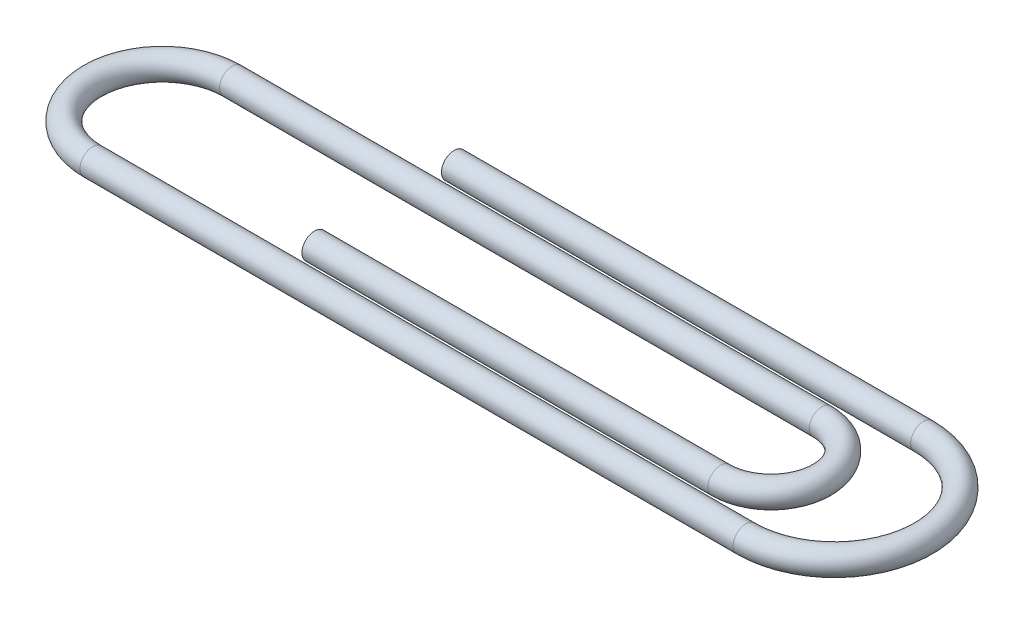
ISO-10303-21;
HEADER;
FILE_DESCRIPTION(('STEP AP214'),'2;1');
FILE_NAME('part.step','',(''),(''),'','','');
FILE_SCHEMA(('AUTOMOTIVE_DESIGN { 1 0 10303 214 1 1 1 1 }'));
ENDSEC;
DATA;
#1=APPLICATION_CONTEXT('core data for automotive mechanical design processes');
#2=APPLICATION_PROTOCOL_DEFINITION('international standard','automotive_design',2000,#1);
#3=PRODUCT_CONTEXT('',#1,'mechanical');
#4=PRODUCT('Part','Part','',(#3));
#5=PRODUCT_RELATED_PRODUCT_CATEGORY('part','',(#4));
#6=PRODUCT_DEFINITION_FORMATION('','',#4);
#7=PRODUCT_DEFINITION_CONTEXT('part definition',#1,'design');
#8=PRODUCT_DEFINITION('design','',#6,#7);
#9=PRODUCT_DEFINITION_SHAPE('','',#8);
#10=(LENGTH_UNIT() NAMED_UNIT(*) SI_UNIT(.MILLI.,.METRE.));
#11=(NAMED_UNIT(*) PLANE_ANGLE_UNIT() SI_UNIT($,.RADIAN.));
#12=(NAMED_UNIT(*) SI_UNIT($,.STERADIAN.) SOLID_ANGLE_UNIT());
#13=UNCERTAINTY_MEASURE_WITH_UNIT(LENGTH_MEASURE(1.E-05),#10,'distance_accuracy_value','');
#14=(GEOMETRIC_REPRESENTATION_CONTEXT(3) GLOBAL_UNCERTAINTY_ASSIGNED_CONTEXT((#13)) GLOBAL_UNIT_ASSIGNED_CONTEXT((#10,
#11,#12)) REPRESENTATION_CONTEXT('',''));
#15=CARTESIAN_POINT('',(0.,0.,0.));
#16=DIRECTION('',(0.,0.,1.));
#17=DIRECTION('',(1.,0.,0.));
#18=AXIS2_PLACEMENT_3D('',#15,#16,#17);
#19=CARTESIAN_POINT('',(0.,0.,0.));
#20=DIRECTION('',(-1.,0.,0.));
#21=DIRECTION('',(0.,0.,1.));
#22=AXIS2_PLACEMENT_3D('',#19,#20,#21);
#23=PLANE('',#22);
#24=CARTESIAN_POINT('',(0.,0.,0.));
#25=DIRECTION('',(-1.,0.,0.));
#26=DIRECTION('',(0.,0.,1.));
#27=AXIS2_PLACEMENT_3D('',#24,#25,#26);
#28=CIRCLE('',#27,0.5);
#29=CARTESIAN_POINT('',(0.,0.,0.5));
#30=VERTEX_POINT('',#29);
#31=EDGE_CURVE('E90',#30,#30,#28,.T.);
#32=ORIENTED_EDGE('',*,*,#31,.T.);
#33=EDGE_LOOP('',(#32));
#34=FACE_BOUND('',#33,.T.);
#35=ADVANCED_FACE('F55',(#34),#23,.T.);
#36=CARTESIAN_POINT('',(0.,0.,5.5));
#37=DIRECTION('',(1.,0.,0.));
#38=DIRECTION('',(0.,0.,-1.));
#39=AXIS2_PLACEMENT_3D('',#36,#37,#38);
#40=PLANE('',#39);
#41=CARTESIAN_POINT('',(0.,0.,5.5));
#42=DIRECTION('',(1.,0.,0.));
#43=DIRECTION('',(0.,0.,-1.));
#44=AXIS2_PLACEMENT_3D('',#41,#42,#43);
#45=CIRCLE('',#44,0.5);
#46=CARTESIAN_POINT('',(0.,0.,5.));
#47=VERTEX_POINT('',#46);
#48=EDGE_CURVE('E11',#47,#47,#45,.T.);
#49=ORIENTED_EDGE('',*,*,#48,.F.);
#50=EDGE_LOOP('',(#49));
#51=FACE_BOUND('',#50,.T.);
#52=ADVANCED_FACE('F99',(#51),#40,.F.);
#53=CARTESIAN_POINT('',(0.,0.,0.));
#54=DIRECTION('',(1.,0.,0.));
#55=DIRECTION('',(0.,0.,-1.));
#56=AXIS2_PLACEMENT_3D('',#53,#54,#55);
#57=CYLINDRICAL_SURFACE('',#56,0.5);
#58=CARTESIAN_POINT('',(18.5,0.,0.));
#59=DIRECTION('',(-1.,0.,0.));
#60=DIRECTION('',(0.,0.,1.));
#61=AXIS2_PLACEMENT_3D('',#58,#59,#60);
#62=CIRCLE('',#61,0.5);
#63=CARTESIAN_POINT('',(18.5,0.,-0.5));
#64=VERTEX_POINT('',#63);
#65=EDGE_CURVE('E86',#64,#64,#62,.T.);
#66=ORIENTED_EDGE('',*,*,#65,.T.);
#67=EDGE_LOOP('',(#66));
#68=FACE_BOUND('',#67,.T.);
#69=ORIENTED_EDGE('',*,*,#31,.F.);
#70=EDGE_LOOP('',(#69));
#71=FACE_BOUND('',#70,.T.);
#72=ADVANCED_FACE('F96',(#68,#71),#57,.T.);
#73=CARTESIAN_POINT('',(18.5,0.,3.5));
#74=DIRECTION('',(0.,-1.,0.));
#75=DIRECTION('',(0.,0.,-1.));
#76=AXIS2_PLACEMENT_3D('',#73,#74,#75);
#77=TOROIDAL_SURFACE('',#76,3.5,0.5);
#78=CARTESIAN_POINT('',(18.5,0.,7.));
#79=DIRECTION('',(1.,0.,0.));
#80=DIRECTION('',(0.,0.,-1.));
#81=AXIS2_PLACEMENT_3D('',#78,#79,#80);
#82=CIRCLE('',#81,0.5);
#83=CARTESIAN_POINT('',(18.5,0.,7.5));
#84=VERTEX_POINT('',#83);
#85=EDGE_CURVE('E82',#84,#84,#82,.T.);
#86=CARTESIAN_POINT('',(18.5,0.,3.5));
#87=DIRECTION('',(0.,-1.,0.));
#88=DIRECTION('',(0.,0.,-1.));
#89=AXIS2_PLACEMENT_3D('',#86,#87,#88);
#90=CIRCLE('',#89,4.);
#91=EDGE_CURVE('',#64,#84,#90,.T.);
#92=ORIENTED_EDGE('',*,*,#65,.F.);
#93=ORIENTED_EDGE('',*,*,#85,.T.);
#94=ORIENTED_EDGE('',*,*,#91,.T.);
#95=ORIENTED_EDGE('',*,*,#91,.F.);
#96=EDGE_LOOP('',(#92,#94,#93,#95));
#97=FACE_BOUND('',#96,.T.);
#98=ADVANCED_FACE('F98',(#97),#77,.T.);
#99=CARTESIAN_POINT('',(18.5,0.,7.));
#100=DIRECTION('',(-1.,0.,0.));
#101=DIRECTION('',(0.,0.,1.));
#102=AXIS2_PLACEMENT_3D('',#99,#100,#101);
#103=CYLINDRICAL_SURFACE('',#102,0.5);
#104=CARTESIAN_POINT('',(-7.25,0.,7.));
#105=DIRECTION('',(1.,0.,0.));
#106=DIRECTION('',(0.,0.,-1.));
#107=AXIS2_PLACEMENT_3D('',#104,#105,#106);
#108=CIRCLE('',#107,0.5);
#109=CARTESIAN_POINT('',(-7.25,0.,7.5));
#110=VERTEX_POINT('',#109);
#111=EDGE_CURVE('E78',#110,#110,#108,.T.);
#112=ORIENTED_EDGE('',*,*,#111,.T.);
#113=EDGE_LOOP('',(#112));
#114=FACE_BOUND('',#113,.T.);
#115=ORIENTED_EDGE('',*,*,#85,.F.);
#116=EDGE_LOOP('',(#115));
#117=FACE_BOUND('',#116,.T.);
#118=ADVANCED_FACE('F106',(#114,#117),#103,.T.);
#119=CARTESIAN_POINT('',(-7.25,0.,4.25));
#120=DIRECTION('',(0.,-1.,0.));
#121=DIRECTION('',(0.,0.,-1.));
#122=AXIS2_PLACEMENT_3D('',#119,#120,#121);
#123=TOROIDAL_SURFACE('',#122,2.75,0.5);
#124=CARTESIAN_POINT('',(-7.25,0.,1.5));
#125=DIRECTION('',(-1.,0.,0.));
#126=DIRECTION('',(0.,0.,1.));
#127=AXIS2_PLACEMENT_3D('',#124,#125,#126);
#128=CIRCLE('',#127,0.5);
#129=CARTESIAN_POINT('',(-7.25,0.,1.));
#130=VERTEX_POINT('',#129);
#131=EDGE_CURVE('E72',#130,#130,#128,.T.);
#132=CARTESIAN_POINT('',(-7.25,0.,4.25));
#133=DIRECTION('',(0.,-1.,0.));
#134=DIRECTION('',(0.,0.,-1.));
#135=AXIS2_PLACEMENT_3D('',#132,#133,#134);
#136=CIRCLE('',#135,3.25);
#137=EDGE_CURVE('',#110,#130,#136,.T.);
#138=ORIENTED_EDGE('',*,*,#111,.F.);
#139=ORIENTED_EDGE('',*,*,#131,.T.);
#140=ORIENTED_EDGE('',*,*,#137,.T.);
#141=ORIENTED_EDGE('',*,*,#137,.F.);
#142=EDGE_LOOP('',(#138,#140,#139,#141));
#143=FACE_BOUND('',#142,.T.);
#144=ADVANCED_FACE('F123',(#143),#123,.T.);
#145=CARTESIAN_POINT('',(-7.25,0.,1.5));
#146=DIRECTION('',(1.,0.,0.));
#147=DIRECTION('',(0.,0.,-1.));
#148=AXIS2_PLACEMENT_3D('',#145,#146,#147);
#149=CYLINDRICAL_SURFACE('',#148,0.5);
#150=CARTESIAN_POINT('',(16.,0.,1.5));
#151=DIRECTION('',(-1.,0.,0.));
#152=DIRECTION('',(0.,0.,1.));
#153=AXIS2_PLACEMENT_3D('',#150,#151,#152);
#154=CIRCLE('',#153,0.5);
#155=CARTESIAN_POINT('',(16.,0.,0.999999999999994));
#156=VERTEX_POINT('',#155);
#157=EDGE_CURVE('E67',#156,#156,#154,.T.);
#158=ORIENTED_EDGE('',*,*,#157,.T.);
#159=EDGE_LOOP('',(#158));
#160=FACE_BOUND('',#159,.T.);
#161=ORIENTED_EDGE('',*,*,#131,.F.);
#162=EDGE_LOOP('',(#161));
#163=FACE_BOUND('',#162,.T.);
#164=ADVANCED_FACE('F117',(#160,#163),#149,.T.);
#165=CARTESIAN_POINT('',(16.,0.,3.5));
#166=DIRECTION('',(0.,-1.,0.));
#167=DIRECTION('',(0.,0.,-1.));
#168=AXIS2_PLACEMENT_3D('',#165,#166,#167);
#169=TOROIDAL_SURFACE('',#168,2.,0.5);
#170=CARTESIAN_POINT('',(16.,0.,5.5));
#171=DIRECTION('',(1.,0.,0.));
#172=DIRECTION('',(0.,0.,-1.));
#173=AXIS2_PLACEMENT_3D('',#170,#171,#172);
#174=CIRCLE('',#173,0.5);
#175=CARTESIAN_POINT('',(16.,0.,6.));
#176=VERTEX_POINT('',#175);
#177=EDGE_CURVE('E62',#176,#176,#174,.T.);
#178=CARTESIAN_POINT('',(16.,0.,3.5));
#179=DIRECTION('',(0.,-1.,0.));
#180=DIRECTION('',(0.,0.,-1.));
#181=AXIS2_PLACEMENT_3D('',#178,#179,#180);
#182=CIRCLE('',#181,2.5);
#183=EDGE_CURVE('',#156,#176,#182,.T.);
#184=ORIENTED_EDGE('',*,*,#157,.F.);
#185=ORIENTED_EDGE('',*,*,#177,.T.);
#186=ORIENTED_EDGE('',*,*,#183,.T.);
#187=ORIENTED_EDGE('',*,*,#183,.F.);
#188=EDGE_LOOP('',(#184,#186,#185,#187));
#189=FACE_BOUND('',#188,.T.);
#190=ADVANCED_FACE('F112',(#189),#169,.T.);
#191=CARTESIAN_POINT('',(16.,0.,5.5));
#192=DIRECTION('',(-1.,0.,0.));
#193=DIRECTION('',(0.,0.,1.));
#194=AXIS2_PLACEMENT_3D('',#191,#192,#193);
#195=CYLINDRICAL_SURFACE('',#194,0.5);
#196=ORIENTED_EDGE('',*,*,#48,.T.);
#197=EDGE_LOOP('',(#196));
#198=FACE_BOUND('',#197,.T.);
#199=ORIENTED_EDGE('',*,*,#177,.F.);
#200=EDGE_LOOP('',(#199));
#201=FACE_BOUND('',#200,.T.);
#202=ADVANCED_FACE('F110',(#198,#201),#195,.T.);
#203=CLOSED_SHELL('',(#35,#52,#72,#98,#118,#144,#164,#190,#202));
#204=MANIFOLD_SOLID_BREP('B2',#203);
#205=ADVANCED_BREP_SHAPE_REPRESENTATION('',(#18,#204),#14);
#206=SHAPE_DEFINITION_REPRESENTATION(#9,#205);
ENDSEC;
END-ISO-10303-21;
